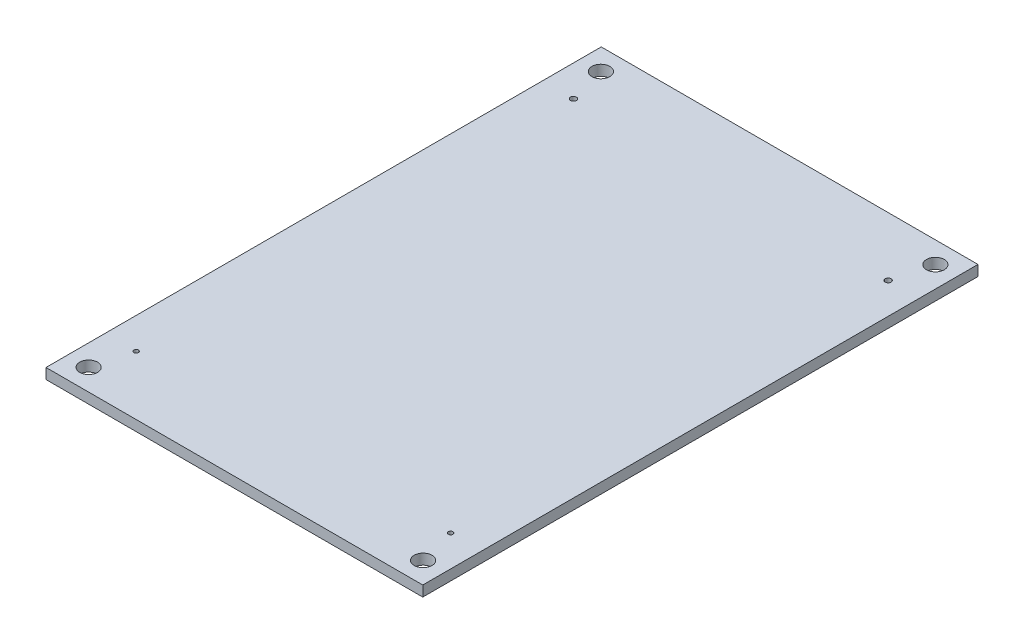
ISO-10303-21;
HEADER;
FILE_DESCRIPTION(('STEP AP214'),'2;1');
FILE_NAME('part.step','',(''),(''),'','','');
FILE_SCHEMA(('AUTOMOTIVE_DESIGN { 1 0 10303 214 1 1 1 1 }'));
ENDSEC;
DATA;
#1=APPLICATION_CONTEXT('core data for automotive mechanical design processes');
#2=APPLICATION_PROTOCOL_DEFINITION('international standard','automotive_design',2000,#1);
#3=PRODUCT_CONTEXT('',#1,'mechanical');
#4=PRODUCT('Part','Part','',(#3));
#5=PRODUCT_RELATED_PRODUCT_CATEGORY('part','',(#4));
#6=PRODUCT_DEFINITION_FORMATION('','',#4);
#7=PRODUCT_DEFINITION_CONTEXT('part definition',#1,'design');
#8=PRODUCT_DEFINITION('design','',#6,#7);
#9=PRODUCT_DEFINITION_SHAPE('','',#8);
#10=(LENGTH_UNIT() NAMED_UNIT(*) SI_UNIT(.MILLI.,.METRE.));
#11=(NAMED_UNIT(*) PLANE_ANGLE_UNIT() SI_UNIT($,.RADIAN.));
#12=(NAMED_UNIT(*) SI_UNIT($,.STERADIAN.) SOLID_ANGLE_UNIT());
#13=UNCERTAINTY_MEASURE_WITH_UNIT(LENGTH_MEASURE(1.E-05),#10,'distance_accuracy_value','');
#14=(GEOMETRIC_REPRESENTATION_CONTEXT(3) GLOBAL_UNCERTAINTY_ASSIGNED_CONTEXT((#13)) GLOBAL_UNIT_ASSIGNED_CONTEXT((#10,
#11,#12)) REPRESENTATION_CONTEXT('',''));
#15=CARTESIAN_POINT('',(0.,0.,0.));
#16=DIRECTION('',(0.,0.,1.));
#17=DIRECTION('',(1.,0.,0.));
#18=AXIS2_PLACEMENT_3D('',#15,#16,#17);
#19=CARTESIAN_POINT('',(-28.5,0.79375,42.));
#20=DIRECTION('',(0.,1.,0.));
#21=DIRECTION('',(0.,0.,1.));
#22=AXIS2_PLACEMENT_3D('',#19,#20,#21);
#23=PLANE('',#22);
#24=CARTESIAN_POINT('',(23.8,0.79375,-33.1));
#25=DIRECTION('',(0.,1.,0.));
#26=DIRECTION('',(0.,0.,1.));
#27=AXIS2_PLACEMENT_3D('',#24,#25,#26);
#28=CIRCLE('',#27,0.449999999999998);
#29=CARTESIAN_POINT('',(23.8,0.79375,-32.65));
#30=VERTEX_POINT('',#29);
#31=EDGE_CURVE('E143',#30,#30,#28,.T.);
#32=ORIENTED_EDGE('',*,*,#31,.F.);
#33=EDGE_LOOP('',(#32));
#34=FACE_BOUND('',#33,.T.);
#35=CARTESIAN_POINT('',(23.8,0.79375,33.07));
#36=DIRECTION('',(0.,1.,0.));
#37=DIRECTION('',(0.,0.,1.));
#38=AXIS2_PLACEMENT_3D('',#35,#36,#37);
#39=CIRCLE('',#38,0.350000000000005);
#40=CARTESIAN_POINT('',(23.8,0.79375,33.42));
#41=VERTEX_POINT('',#40);
#42=EDGE_CURVE('E131',#41,#41,#39,.T.);
#43=ORIENTED_EDGE('',*,*,#42,.F.);
#44=EDGE_LOOP('',(#43));
#45=FACE_BOUND('',#44,.T.);
#46=CARTESIAN_POINT('',(-25.3,0.79375,38.75));
#47=DIRECTION('',(0.,1.,0.));
#48=DIRECTION('',(0.,0.,1.));
#49=AXIS2_PLACEMENT_3D('',#46,#47,#48);
#50=CIRCLE('',#49,1.35);
#51=CARTESIAN_POINT('',(-25.3,0.79375,40.1));
#52=VERTEX_POINT('',#51);
#53=EDGE_CURVE('E119',#52,#52,#50,.T.);
#54=ORIENTED_EDGE('',*,*,#53,.F.);
#55=EDGE_LOOP('',(#54));
#56=FACE_BOUND('',#55,.T.);
#57=CARTESIAN_POINT('',(25.3,0.79375,-38.75));
#58=DIRECTION('',(0.,1.,0.));
#59=DIRECTION('',(0.,0.,1.));
#60=AXIS2_PLACEMENT_3D('',#57,#58,#59);
#61=CIRCLE('',#60,1.35);
#62=CARTESIAN_POINT('',(25.3,0.79375,-37.4));
#63=VERTEX_POINT('',#62);
#64=EDGE_CURVE('E98',#63,#63,#61,.T.);
#65=ORIENTED_EDGE('',*,*,#64,.F.);
#66=EDGE_LOOP('',(#65));
#67=FACE_BOUND('',#66,.T.);
#68=DIRECTION('',(0.,0.,1.));
#69=VECTOR('',#68,1.);
#70=CARTESIAN_POINT('',(-28.5,0.79375,-42.));
#71=LINE('',#70,#69);
#72=CARTESIAN_POINT('',(-28.5,0.79375,-42.));
#73=VERTEX_POINT('',#72);
#74=CARTESIAN_POINT('',(-28.5,0.79375,42.));
#75=VERTEX_POINT('',#74);
#76=EDGE_CURVE('E83',#73,#75,#71,.T.);
#77=ORIENTED_EDGE('',*,*,#76,.T.);
#78=DIRECTION('',(1.,0.,0.));
#79=VECTOR('',#78,1.);
#80=CARTESIAN_POINT('',(-28.5,0.79375,42.));
#81=LINE('',#80,#79);
#82=CARTESIAN_POINT('',(28.5,0.79375,42.));
#83=VERTEX_POINT('',#82);
#84=EDGE_CURVE('E78',#75,#83,#81,.T.);
#85=ORIENTED_EDGE('',*,*,#84,.T.);
#86=DIRECTION('',(0.,0.,-1.));
#87=VECTOR('',#86,1.);
#88=CARTESIAN_POINT('',(28.5,0.79375,42.));
#89=LINE('',#88,#87);
#90=CARTESIAN_POINT('',(28.5,0.79375,-42.));
#91=VERTEX_POINT('',#90);
#92=EDGE_CURVE('E81',#83,#91,#89,.T.);
#93=ORIENTED_EDGE('',*,*,#92,.T.);
#94=DIRECTION('',(-1.,0.,0.));
#95=VECTOR('',#94,1.);
#96=CARTESIAN_POINT('',(28.5,0.79375,-42.));
#97=LINE('',#96,#95);
#98=EDGE_CURVE('E48',#91,#73,#97,.T.);
#99=ORIENTED_EDGE('',*,*,#98,.T.);
#100=EDGE_LOOP('',(#77,#85,#93,#99));
#101=FACE_BOUND('',#100,.T.);
#102=CARTESIAN_POINT('',(25.3,0.79375,38.75));
#103=DIRECTION('',(0.,1.,0.));
#104=DIRECTION('',(0.,0.,1.));
#105=AXIS2_PLACEMENT_3D('',#102,#103,#104);
#106=CIRCLE('',#105,1.35);
#107=CARTESIAN_POINT('',(25.3,0.79375,40.1));
#108=VERTEX_POINT('',#107);
#109=EDGE_CURVE('E113',#108,#108,#106,.T.);
#110=ORIENTED_EDGE('',*,*,#109,.F.);
#111=EDGE_LOOP('',(#110));
#112=FACE_BOUND('',#111,.T.);
#113=CARTESIAN_POINT('',(-25.3,0.79375,-38.75));
#114=DIRECTION('',(0.,1.,0.));
#115=DIRECTION('',(0.,0.,1.));
#116=AXIS2_PLACEMENT_3D('',#113,#114,#115);
#117=CIRCLE('',#116,1.35);
#118=CARTESIAN_POINT('',(-25.3,0.79375,-37.4));
#119=VERTEX_POINT('',#118);
#120=EDGE_CURVE('E125',#119,#119,#117,.T.);
#121=ORIENTED_EDGE('',*,*,#120,.F.);
#122=EDGE_LOOP('',(#121));
#123=FACE_BOUND('',#122,.T.);
#124=CARTESIAN_POINT('',(-23.8,0.79375,33.07));
#125=DIRECTION('',(0.,1.,0.));
#126=DIRECTION('',(0.,0.,1.));
#127=AXIS2_PLACEMENT_3D('',#124,#125,#126);
#128=CIRCLE('',#127,0.350000000000005);
#129=CARTESIAN_POINT('',(-23.8,0.79375,33.42));
#130=VERTEX_POINT('',#129);
#131=EDGE_CURVE('E137',#130,#130,#128,.T.);
#132=ORIENTED_EDGE('',*,*,#131,.F.);
#133=EDGE_LOOP('',(#132));
#134=FACE_BOUND('',#133,.T.);
#135=CARTESIAN_POINT('',(-23.8,0.79375,-33.1));
#136=DIRECTION('',(0.,1.,0.));
#137=DIRECTION('',(0.,0.,1.));
#138=AXIS2_PLACEMENT_3D('',#135,#136,#137);
#139=CIRCLE('',#138,0.449999999999998);
#140=CARTESIAN_POINT('',(-23.8,0.79375,-32.65));
#141=VERTEX_POINT('',#140);
#142=EDGE_CURVE('E149',#141,#141,#139,.T.);
#143=ORIENTED_EDGE('',*,*,#142,.F.);
#144=EDGE_LOOP('',(#143));
#145=FACE_BOUND('',#144,.T.);
#146=ADVANCED_FACE('F31',(#34,#45,#56,#67,#101,#112,#123,#134,#145),#23,.T.);
#147=CARTESIAN_POINT('',(-28.5,-0.79375,42.));
#148=DIRECTION('',(0.,1.,0.));
#149=DIRECTION('',(0.,0.,1.));
#150=AXIS2_PLACEMENT_3D('',#147,#148,#149);
#151=PLANE('',#150);
#152=CARTESIAN_POINT('',(23.8,-0.79375,-33.1));
#153=DIRECTION('',(0.,1.,0.));
#154=DIRECTION('',(0.,0.,1.));
#155=AXIS2_PLACEMENT_3D('',#152,#153,#154);
#156=CIRCLE('',#155,0.449999999999998);
#157=CARTESIAN_POINT('',(23.8,-0.79375,-32.65));
#158=VERTEX_POINT('',#157);
#159=EDGE_CURVE('E146',#158,#158,#156,.T.);
#160=ORIENTED_EDGE('',*,*,#159,.T.);
#161=EDGE_LOOP('',(#160));
#162=FACE_BOUND('',#161,.T.);
#163=CARTESIAN_POINT('',(23.8,-0.79375,33.07));
#164=DIRECTION('',(0.,1.,0.));
#165=DIRECTION('',(0.,0.,1.));
#166=AXIS2_PLACEMENT_3D('',#163,#164,#165);
#167=CIRCLE('',#166,0.350000000000005);
#168=CARTESIAN_POINT('',(23.8,-0.79375,33.42));
#169=VERTEX_POINT('',#168);
#170=EDGE_CURVE('E134',#169,#169,#167,.T.);
#171=ORIENTED_EDGE('',*,*,#170,.T.);
#172=EDGE_LOOP('',(#171));
#173=FACE_BOUND('',#172,.T.);
#174=CARTESIAN_POINT('',(-25.3,-0.79375,38.75));
#175=DIRECTION('',(0.,1.,0.));
#176=DIRECTION('',(0.,0.,1.));
#177=AXIS2_PLACEMENT_3D('',#174,#175,#176);
#178=CIRCLE('',#177,1.35);
#179=CARTESIAN_POINT('',(-25.3,-0.79375,40.1));
#180=VERTEX_POINT('',#179);
#181=EDGE_CURVE('E122',#180,#180,#178,.T.);
#182=ORIENTED_EDGE('',*,*,#181,.T.);
#183=EDGE_LOOP('',(#182));
#184=FACE_BOUND('',#183,.T.);
#185=CARTESIAN_POINT('',(25.3,-0.79375,-38.75));
#186=DIRECTION('',(0.,1.,0.));
#187=DIRECTION('',(0.,0.,1.));
#188=AXIS2_PLACEMENT_3D('',#185,#186,#187);
#189=CIRCLE('',#188,1.35);
#190=CARTESIAN_POINT('',(25.3,-0.79375,-37.4));
#191=VERTEX_POINT('',#190);
#192=EDGE_CURVE('E110',#191,#191,#189,.T.);
#193=ORIENTED_EDGE('',*,*,#192,.T.);
#194=EDGE_LOOP('',(#193));
#195=FACE_BOUND('',#194,.T.);
#196=DIRECTION('',(0.,0.,1.));
#197=VECTOR('',#196,1.);
#198=CARTESIAN_POINT('',(-28.5,-0.79375,-42.));
#199=LINE('',#198,#197);
#200=CARTESIAN_POINT('',(-28.5,-0.79375,-42.));
#201=VERTEX_POINT('',#200);
#202=CARTESIAN_POINT('',(-28.5,-0.79375,42.));
#203=VERTEX_POINT('',#202);
#204=EDGE_CURVE('E95',#201,#203,#199,.T.);
#205=ORIENTED_EDGE('',*,*,#204,.F.);
#206=DIRECTION('',(-1.,0.,0.));
#207=VECTOR('',#206,1.);
#208=CARTESIAN_POINT('',(28.5,-0.79375,-42.));
#209=LINE('',#208,#207);
#210=CARTESIAN_POINT('',(28.5,-0.79375,-42.));
#211=VERTEX_POINT('',#210);
#212=EDGE_CURVE('E71',#211,#201,#209,.T.);
#213=ORIENTED_EDGE('',*,*,#212,.F.);
#214=DIRECTION('',(0.,0.,-1.));
#215=VECTOR('',#214,1.);
#216=CARTESIAN_POINT('',(28.5,-0.79375,42.));
#217=LINE('',#216,#215);
#218=CARTESIAN_POINT('',(28.5,-0.79375,42.));
#219=VERTEX_POINT('',#218);
#220=EDGE_CURVE('E65',#219,#211,#217,.T.);
#221=ORIENTED_EDGE('',*,*,#220,.F.);
#222=DIRECTION('',(1.,0.,0.));
#223=VECTOR('',#222,1.);
#224=CARTESIAN_POINT('',(-28.5,-0.79375,42.));
#225=LINE('',#224,#223);
#226=EDGE_CURVE('E87',#203,#219,#225,.T.);
#227=ORIENTED_EDGE('',*,*,#226,.F.);
#228=EDGE_LOOP('',(#205,#213,#221,#227));
#229=FACE_BOUND('',#228,.T.);
#230=CARTESIAN_POINT('',(25.3,-0.79375,38.75));
#231=DIRECTION('',(0.,1.,0.));
#232=DIRECTION('',(0.,0.,1.));
#233=AXIS2_PLACEMENT_3D('',#230,#231,#232);
#234=CIRCLE('',#233,1.35);
#235=CARTESIAN_POINT('',(25.3,-0.79375,40.1));
#236=VERTEX_POINT('',#235);
#237=EDGE_CURVE('E116',#236,#236,#234,.T.);
#238=ORIENTED_EDGE('',*,*,#237,.T.);
#239=EDGE_LOOP('',(#238));
#240=FACE_BOUND('',#239,.T.);
#241=CARTESIAN_POINT('',(-25.3,-0.79375,-38.75));
#242=DIRECTION('',(0.,1.,0.));
#243=DIRECTION('',(0.,0.,1.));
#244=AXIS2_PLACEMENT_3D('',#241,#242,#243);
#245=CIRCLE('',#244,1.35);
#246=CARTESIAN_POINT('',(-25.3,-0.79375,-37.4));
#247=VERTEX_POINT('',#246);
#248=EDGE_CURVE('E128',#247,#247,#245,.T.);
#249=ORIENTED_EDGE('',*,*,#248,.T.);
#250=EDGE_LOOP('',(#249));
#251=FACE_BOUND('',#250,.T.);
#252=CARTESIAN_POINT('',(-23.8,-0.79375,33.07));
#253=DIRECTION('',(0.,1.,0.));
#254=DIRECTION('',(0.,0.,1.));
#255=AXIS2_PLACEMENT_3D('',#252,#253,#254);
#256=CIRCLE('',#255,0.350000000000005);
#257=CARTESIAN_POINT('',(-23.8,-0.79375,33.42));
#258=VERTEX_POINT('',#257);
#259=EDGE_CURVE('E140',#258,#258,#256,.T.);
#260=ORIENTED_EDGE('',*,*,#259,.T.);
#261=EDGE_LOOP('',(#260));
#262=FACE_BOUND('',#261,.T.);
#263=CARTESIAN_POINT('',(-23.8,-0.79375,-33.1));
#264=DIRECTION('',(0.,1.,0.));
#265=DIRECTION('',(0.,0.,1.));
#266=AXIS2_PLACEMENT_3D('',#263,#264,#265);
#267=CIRCLE('',#266,0.449999999999998);
#268=CARTESIAN_POINT('',(-23.8,-0.79375,-32.65));
#269=VERTEX_POINT('',#268);
#270=EDGE_CURVE('E152',#269,#269,#267,.T.);
#271=ORIENTED_EDGE('',*,*,#270,.T.);
#272=EDGE_LOOP('',(#271));
#273=FACE_BOUND('',#272,.T.);
#274=ADVANCED_FACE('F106',(#162,#173,#184,#195,#229,#240,#251,#262,#273),#151,.F.);
#275=CARTESIAN_POINT('',(-28.5,0.79375,-42.));
#276=DIRECTION('',(1.,0.,0.));
#277=DIRECTION('',(0.,0.,-1.));
#278=AXIS2_PLACEMENT_3D('',#275,#276,#277);
#279=PLANE('',#278);
#280=ORIENTED_EDGE('',*,*,#204,.T.);
#281=DIRECTION('',(0.,-1.,0.));
#282=VECTOR('',#281,1.);
#283=CARTESIAN_POINT('',(-28.5,0.79375,42.));
#284=LINE('',#283,#282);
#285=EDGE_CURVE('E11',#75,#203,#284,.T.);
#286=ORIENTED_EDGE('',*,*,#285,.F.);
#287=ORIENTED_EDGE('',*,*,#76,.F.);
#288=DIRECTION('',(0.,-1.,0.));
#289=VECTOR('',#288,1.);
#290=CARTESIAN_POINT('',(-28.5,0.79375,-42.));
#291=LINE('',#290,#289);
#292=EDGE_CURVE('E91',#73,#201,#291,.T.);
#293=ORIENTED_EDGE('',*,*,#292,.T.);
#294=EDGE_LOOP('',(#280,#286,#287,#293));
#295=FACE_BOUND('',#294,.T.);
#296=ADVANCED_FACE('F33',(#295),#279,.F.);
#297=CARTESIAN_POINT('',(-28.5,0.79375,42.));
#298=DIRECTION('',(0.,0.,-1.));
#299=DIRECTION('',(-1.,0.,0.));
#300=AXIS2_PLACEMENT_3D('',#297,#298,#299);
#301=PLANE('',#300);
#302=ORIENTED_EDGE('',*,*,#226,.T.);
#303=DIRECTION('',(0.,-1.,0.));
#304=VECTOR('',#303,1.);
#305=CARTESIAN_POINT('',(28.5,0.79375,42.));
#306=LINE('',#305,#304);
#307=EDGE_CURVE('E40',#83,#219,#306,.T.);
#308=ORIENTED_EDGE('',*,*,#307,.F.);
#309=ORIENTED_EDGE('',*,*,#84,.F.);
#310=ORIENTED_EDGE('',*,*,#285,.T.);
#311=EDGE_LOOP('',(#302,#308,#309,#310));
#312=FACE_BOUND('',#311,.T.);
#313=ADVANCED_FACE('F86',(#312),#301,.F.);
#314=CARTESIAN_POINT('',(28.5,0.79375,42.));
#315=DIRECTION('',(-1.,0.,0.));
#316=DIRECTION('',(0.,0.,1.));
#317=AXIS2_PLACEMENT_3D('',#314,#315,#316);
#318=PLANE('',#317);
#319=ORIENTED_EDGE('',*,*,#220,.T.);
#320=DIRECTION('',(0.,-1.,0.));
#321=VECTOR('',#320,1.);
#322=CARTESIAN_POINT('',(28.5,0.79375,-42.));
#323=LINE('',#322,#321);
#324=EDGE_CURVE('E88',#91,#211,#323,.T.);
#325=ORIENTED_EDGE('',*,*,#324,.F.);
#326=ORIENTED_EDGE('',*,*,#92,.F.);
#327=ORIENTED_EDGE('',*,*,#307,.T.);
#328=EDGE_LOOP('',(#319,#325,#326,#327));
#329=FACE_BOUND('',#328,.T.);
#330=ADVANCED_FACE('F89',(#329),#318,.F.);
#331=CARTESIAN_POINT('',(28.5,0.79375,-42.));
#332=DIRECTION('',(0.,0.,1.));
#333=DIRECTION('',(1.,0.,0.));
#334=AXIS2_PLACEMENT_3D('',#331,#332,#333);
#335=PLANE('',#334);
#336=ORIENTED_EDGE('',*,*,#212,.T.);
#337=ORIENTED_EDGE('',*,*,#292,.F.);
#338=ORIENTED_EDGE('',*,*,#98,.F.);
#339=ORIENTED_EDGE('',*,*,#324,.T.);
#340=EDGE_LOOP('',(#336,#337,#338,#339));
#341=FACE_BOUND('',#340,.T.);
#342=ADVANCED_FACE('F103',(#341),#335,.F.);
#343=CARTESIAN_POINT('',(25.3,0.79375,-38.75));
#344=DIRECTION('',(0.,-1.,0.));
#345=DIRECTION('',(0.,0.,-1.));
#346=AXIS2_PLACEMENT_3D('',#343,#344,#345);
#347=CYLINDRICAL_SURFACE('',#346,1.35);
#348=ORIENTED_EDGE('',*,*,#64,.T.);
#349=EDGE_LOOP('',(#348));
#350=FACE_BOUND('',#349,.T.);
#351=ORIENTED_EDGE('',*,*,#192,.F.);
#352=EDGE_LOOP('',(#351));
#353=FACE_BOUND('',#352,.T.);
#354=ADVANCED_FACE('F172',(#350,#353),#347,.F.);
#355=CARTESIAN_POINT('',(25.3,0.79375,38.75));
#356=DIRECTION('',(0.,-1.,0.));
#357=DIRECTION('',(0.,0.,-1.));
#358=AXIS2_PLACEMENT_3D('',#355,#356,#357);
#359=CYLINDRICAL_SURFACE('',#358,1.35);
#360=ORIENTED_EDGE('',*,*,#109,.T.);
#361=EDGE_LOOP('',(#360));
#362=FACE_BOUND('',#361,.T.);
#363=ORIENTED_EDGE('',*,*,#237,.F.);
#364=EDGE_LOOP('',(#363));
#365=FACE_BOUND('',#364,.T.);
#366=ADVANCED_FACE('F218',(#362,#365),#359,.F.);
#367=CARTESIAN_POINT('',(-25.3,0.79375,38.75));
#368=DIRECTION('',(0.,-1.,0.));
#369=DIRECTION('',(0.,0.,-1.));
#370=AXIS2_PLACEMENT_3D('',#367,#368,#369);
#371=CYLINDRICAL_SURFACE('',#370,1.35);
#372=ORIENTED_EDGE('',*,*,#53,.T.);
#373=EDGE_LOOP('',(#372));
#374=FACE_BOUND('',#373,.T.);
#375=ORIENTED_EDGE('',*,*,#181,.F.);
#376=EDGE_LOOP('',(#375));
#377=FACE_BOUND('',#376,.T.);
#378=ADVANCED_FACE('F226',(#374,#377),#371,.F.);
#379=CARTESIAN_POINT('',(-25.3,0.79375,-38.75));
#380=DIRECTION('',(0.,-1.,0.));
#381=DIRECTION('',(0.,0.,-1.));
#382=AXIS2_PLACEMENT_3D('',#379,#380,#381);
#383=CYLINDRICAL_SURFACE('',#382,1.35);
#384=ORIENTED_EDGE('',*,*,#120,.T.);
#385=EDGE_LOOP('',(#384));
#386=FACE_BOUND('',#385,.T.);
#387=ORIENTED_EDGE('',*,*,#248,.F.);
#388=EDGE_LOOP('',(#387));
#389=FACE_BOUND('',#388,.T.);
#390=ADVANCED_FACE('F234',(#386,#389),#383,.F.);
#391=CARTESIAN_POINT('',(23.8,0.79375,33.07));
#392=DIRECTION('',(0.,-1.,0.));
#393=DIRECTION('',(0.,0.,-1.));
#394=AXIS2_PLACEMENT_3D('',#391,#392,#393);
#395=CYLINDRICAL_SURFACE('',#394,0.350000000000005);
#396=ORIENTED_EDGE('',*,*,#42,.T.);
#397=EDGE_LOOP('',(#396));
#398=FACE_BOUND('',#397,.T.);
#399=ORIENTED_EDGE('',*,*,#170,.F.);
#400=EDGE_LOOP('',(#399));
#401=FACE_BOUND('',#400,.T.);
#402=ADVANCED_FACE('F243',(#398,#401),#395,.F.);
#403=CARTESIAN_POINT('',(-23.8,0.79375,33.07));
#404=DIRECTION('',(0.,-1.,0.));
#405=DIRECTION('',(0.,0.,-1.));
#406=AXIS2_PLACEMENT_3D('',#403,#404,#405);
#407=CYLINDRICAL_SURFACE('',#406,0.350000000000005);
#408=ORIENTED_EDGE('',*,*,#131,.T.);
#409=EDGE_LOOP('',(#408));
#410=FACE_BOUND('',#409,.T.);
#411=ORIENTED_EDGE('',*,*,#259,.F.);
#412=EDGE_LOOP('',(#411));
#413=FACE_BOUND('',#412,.T.);
#414=ADVANCED_FACE('F252',(#410,#413),#407,.F.);
#415=CARTESIAN_POINT('',(23.8,0.79375,-33.1));
#416=DIRECTION('',(0.,-1.,0.));
#417=DIRECTION('',(0.,0.,-1.));
#418=AXIS2_PLACEMENT_3D('',#415,#416,#417);
#419=CYLINDRICAL_SURFACE('',#418,0.449999999999998);
#420=ORIENTED_EDGE('',*,*,#31,.T.);
#421=EDGE_LOOP('',(#420));
#422=FACE_BOUND('',#421,.T.);
#423=ORIENTED_EDGE('',*,*,#159,.F.);
#424=EDGE_LOOP('',(#423));
#425=FACE_BOUND('',#424,.T.);
#426=ADVANCED_FACE('F261',(#422,#425),#419,.F.);
#427=CARTESIAN_POINT('',(-23.8,0.79375,-33.1));
#428=DIRECTION('',(0.,-1.,0.));
#429=DIRECTION('',(0.,0.,-1.));
#430=AXIS2_PLACEMENT_3D('',#427,#428,#429);
#431=CYLINDRICAL_SURFACE('',#430,0.449999999999998);
#432=ORIENTED_EDGE('',*,*,#142,.T.);
#433=EDGE_LOOP('',(#432));
#434=FACE_BOUND('',#433,.T.);
#435=ORIENTED_EDGE('',*,*,#270,.F.);
#436=EDGE_LOOP('',(#435));
#437=FACE_BOUND('',#436,.T.);
#438=ADVANCED_FACE('F158',(#434,#437),#431,.F.);
#439=CLOSED_SHELL('',(#146,#274,#296,#313,#330,#342,#354,#366,#378,#390,#402,#414,#426,#438));
#440=MANIFOLD_SOLID_BREP('B2',#439);
#441=ADVANCED_BREP_SHAPE_REPRESENTATION('',(#18,#440),#14);
#442=SHAPE_DEFINITION_REPRESENTATION(#9,#441);
ENDSEC;
END-ISO-10303-21;
